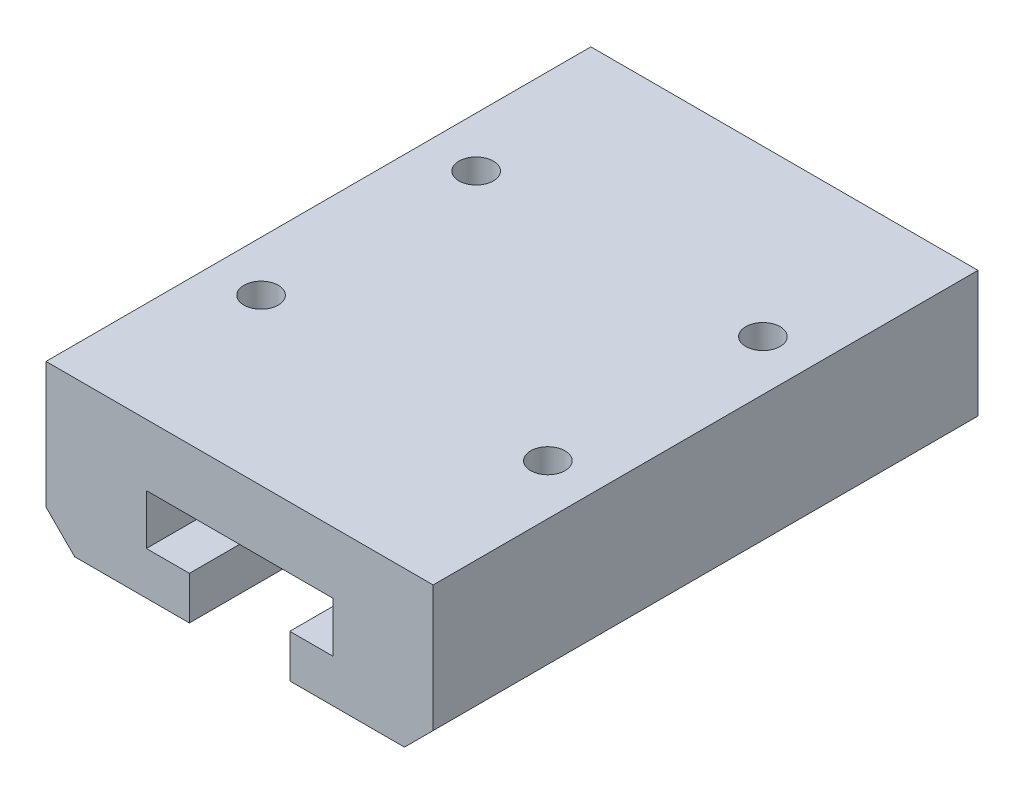
ISO-10303-21;
HEADER;
FILE_DESCRIPTION(('STEP AP214'),'2;1');
FILE_NAME('part.step','',(''),(''),'','','');
FILE_SCHEMA(('AUTOMOTIVE_DESIGN { 1 0 10303 214 1 1 1 1 }'));
ENDSEC;
DATA;
#1=APPLICATION_CONTEXT('core data for automotive mechanical design processes');
#2=APPLICATION_PROTOCOL_DEFINITION('international standard','automotive_design',2000,#1);
#3=PRODUCT_CONTEXT('',#1,'mechanical');
#4=PRODUCT('Part','Part','',(#3));
#5=PRODUCT_RELATED_PRODUCT_CATEGORY('part','',(#4));
#6=PRODUCT_DEFINITION_FORMATION('','',#4);
#7=PRODUCT_DEFINITION_CONTEXT('part definition',#1,'design');
#8=PRODUCT_DEFINITION('design','',#6,#7);
#9=PRODUCT_DEFINITION_SHAPE('','',#8);
#10=(LENGTH_UNIT() NAMED_UNIT(*) SI_UNIT(.MILLI.,.METRE.));
#11=(NAMED_UNIT(*) PLANE_ANGLE_UNIT() SI_UNIT($,.RADIAN.));
#12=(NAMED_UNIT(*) SI_UNIT($,.STERADIAN.) SOLID_ANGLE_UNIT());
#13=UNCERTAINTY_MEASURE_WITH_UNIT(LENGTH_MEASURE(1.E-05),#10,'distance_accuracy_value','');
#14=(GEOMETRIC_REPRESENTATION_CONTEXT(3) GLOBAL_UNCERTAINTY_ASSIGNED_CONTEXT((#13)) GLOBAL_UNIT_ASSIGNED_CONTEXT((#10,
#11,#12)) REPRESENTATION_CONTEXT('',''));
#15=CARTESIAN_POINT('',(0.,0.,0.));
#16=DIRECTION('',(0.,0.,1.));
#17=DIRECTION('',(1.,0.,0.));
#18=AXIS2_PLACEMENT_3D('',#15,#16,#17);
#19=CARTESIAN_POINT('',(-13.5,0.,-19.));
#20=DIRECTION('',(0.,-1.,0.));
#21=DIRECTION('',(1.,0.,0.));
#22=AXIS2_PLACEMENT_3D('',#19,#20,#21);
#23=PLANE('',#22);
#24=DIRECTION('',(1.,0.,0.));
#25=VECTOR('',#24,1.);
#26=CARTESIAN_POINT('',(-13.5,0.,19.));
#27=LINE('',#26,#25);
#28=CARTESIAN_POINT('',(-11.5,0.,19.));
#29=VERTEX_POINT('',#28);
#30=CARTESIAN_POINT('',(-3.5,0.,19.));
#31=VERTEX_POINT('',#30);
#32=EDGE_CURVE('E156',#29,#31,#27,.T.);
#33=ORIENTED_EDGE('',*,*,#32,.F.);
#34=DIRECTION('',(0.,0.,-1.));
#35=VECTOR('',#34,1.);
#36=CARTESIAN_POINT('',(-11.5,0.,-19.));
#37=LINE('',#36,#35);
#38=CARTESIAN_POINT('',(-11.5,0.,9.5));
#39=VERTEX_POINT('',#38);
#40=EDGE_CURVE('E269',#29,#39,#37,.T.);
#41=ORIENTED_EDGE('',*,*,#40,.T.);
#42=CARTESIAN_POINT('',(-10.,0.,7.5));
#43=DIRECTION('',(0.,-1.,0.));
#44=DIRECTION('',(0.,0.,-1.));
#45=AXIS2_PLACEMENT_3D('',#42,#43,#44);
#46=CIRCLE('',#45,2.5);
#47=CARTESIAN_POINT('',(-11.5,0.,5.5));
#48=VERTEX_POINT('',#47);
#49=EDGE_CURVE('E322',#48,#39,#46,.T.);
#50=ORIENTED_EDGE('',*,*,#49,.F.);
#51=DIRECTION('',(0.,0.,-1.));
#52=VECTOR('',#51,1.);
#53=CARTESIAN_POINT('',(-11.5,0.,-19.));
#54=LINE('',#53,#52);
#55=CARTESIAN_POINT('',(-11.5,0.,-5.5));
#56=VERTEX_POINT('',#55);
#57=EDGE_CURVE('E267',#48,#56,#54,.T.);
#58=ORIENTED_EDGE('',*,*,#57,.T.);
#59=CARTESIAN_POINT('',(-10.,0.,-7.5));
#60=DIRECTION('',(0.,-1.,0.));
#61=DIRECTION('',(0.,0.,-1.));
#62=AXIS2_PLACEMENT_3D('',#59,#60,#61);
#63=CIRCLE('',#62,2.5);
#64=CARTESIAN_POINT('',(-11.5,0.,-9.5));
#65=VERTEX_POINT('',#64);
#66=EDGE_CURVE('E341',#65,#56,#63,.T.);
#67=ORIENTED_EDGE('',*,*,#66,.F.);
#68=DIRECTION('',(0.,0.,-1.));
#69=VECTOR('',#68,1.);
#70=CARTESIAN_POINT('',(-11.5,0.,-19.));
#71=LINE('',#70,#69);
#72=CARTESIAN_POINT('',(-11.5,0.,-19.));
#73=VERTEX_POINT('',#72);
#74=EDGE_CURVE('E265',#65,#73,#71,.T.);
#75=ORIENTED_EDGE('',*,*,#74,.T.);
#76=DIRECTION('',(1.,0.,0.));
#77=VECTOR('',#76,1.);
#78=CARTESIAN_POINT('',(-13.5,0.,-19.));
#79=LINE('',#78,#77);
#80=CARTESIAN_POINT('',(-3.5,0.,-19.));
#81=VERTEX_POINT('',#80);
#82=EDGE_CURVE('E172',#73,#81,#79,.T.);
#83=ORIENTED_EDGE('',*,*,#82,.T.);
#84=DIRECTION('',(0.,0.,1.));
#85=VECTOR('',#84,1.);
#86=CARTESIAN_POINT('',(-3.5,0.,-19.));
#87=LINE('',#86,#85);
#88=EDGE_CURVE('E170',#81,#31,#87,.T.);
#89=ORIENTED_EDGE('',*,*,#88,.T.);
#90=EDGE_LOOP('',(#33,#41,#50,#58,#67,#75,#83,#89));
#91=FACE_BOUND('',#90,.T.);
#92=ADVANCED_FACE('F32',(#91),#23,.T.);
#93=CARTESIAN_POINT('',(-13.5,10.8,-19.));
#94=DIRECTION('',(-1.,0.,0.));
#95=DIRECTION('',(0.,-1.,0.));
#96=AXIS2_PLACEMENT_3D('',#93,#94,#95);
#97=PLANE('',#96);
#98=DIRECTION('',(0.,-1.,0.));
#99=VECTOR('',#98,1.);
#100=CARTESIAN_POINT('',(-13.5,10.8,-19.));
#101=LINE('',#100,#99);
#102=CARTESIAN_POINT('',(-13.5,10.8,-19.));
#103=VERTEX_POINT('',#102);
#104=CARTESIAN_POINT('',(-13.5,2.,-19.));
#105=VERTEX_POINT('',#104);
#106=EDGE_CURVE('E177',#103,#105,#101,.T.);
#107=ORIENTED_EDGE('',*,*,#106,.T.);
#108=DIRECTION('',(0.,0.,1.));
#109=VECTOR('',#108,1.);
#110=CARTESIAN_POINT('',(-13.5,2.,-19.));
#111=LINE('',#110,#109);
#112=CARTESIAN_POINT('',(-13.5,2.,19.));
#113=VERTEX_POINT('',#112);
#114=EDGE_CURVE('E243',#105,#113,#111,.T.);
#115=ORIENTED_EDGE('',*,*,#114,.T.);
#116=DIRECTION('',(0.,-1.,0.));
#117=VECTOR('',#116,1.);
#118=CARTESIAN_POINT('',(-13.5,10.8,19.));
#119=LINE('',#118,#117);
#120=CARTESIAN_POINT('',(-13.5,10.8,19.));
#121=VERTEX_POINT('',#120);
#122=EDGE_CURVE('E208',#121,#113,#119,.T.);
#123=ORIENTED_EDGE('',*,*,#122,.F.);
#124=DIRECTION('',(0.,0.,1.));
#125=VECTOR('',#124,1.);
#126=CARTESIAN_POINT('',(-13.5,10.8,-19.));
#127=LINE('',#126,#125);
#128=EDGE_CURVE('E241',#103,#121,#127,.T.);
#129=ORIENTED_EDGE('',*,*,#128,.F.);
#130=EDGE_LOOP('',(#107,#115,#123,#129));
#131=FACE_BOUND('',#130,.T.);
#132=ADVANCED_FACE('F311',(#131),#97,.T.);
#133=CARTESIAN_POINT('',(13.5,10.8,-19.));
#134=DIRECTION('',(0.,1.,0.));
#135=DIRECTION('',(0.,0.,1.));
#136=AXIS2_PLACEMENT_3D('',#133,#134,#135);
#137=PLANE('',#136);
#138=CARTESIAN_POINT('',(10.,10.8,7.5));
#139=DIRECTION('',(0.,-1.,0.));
#140=DIRECTION('',(0.,0.,-1.));
#141=AXIS2_PLACEMENT_3D('',#138,#139,#140);
#142=CIRCLE('',#141,1.2);
#143=CARTESIAN_POINT('',(10.,10.8,6.3));
#144=VERTEX_POINT('',#143);
#145=EDGE_CURVE('E401',#144,#144,#142,.T.);
#146=ORIENTED_EDGE('',*,*,#145,.T.);
#147=EDGE_LOOP('',(#146));
#148=FACE_BOUND('',#147,.T.);
#149=CARTESIAN_POINT('',(10.,10.8,-7.5));
#150=DIRECTION('',(0.,-1.,0.));
#151=DIRECTION('',(0.,0.,-1.));
#152=AXIS2_PLACEMENT_3D('',#149,#150,#151);
#153=CIRCLE('',#152,1.2);
#154=CARTESIAN_POINT('',(10.,10.8,-8.7));
#155=VERTEX_POINT('',#154);
#156=EDGE_CURVE('E326',#155,#155,#153,.T.);
#157=ORIENTED_EDGE('',*,*,#156,.T.);
#158=EDGE_LOOP('',(#157));
#159=FACE_BOUND('',#158,.T.);
#160=CARTESIAN_POINT('',(-10.,10.8,7.5));
#161=DIRECTION('',(0.,-1.,0.));
#162=DIRECTION('',(0.,0.,-1.));
#163=AXIS2_PLACEMENT_3D('',#160,#161,#162);
#164=CIRCLE('',#163,1.2);
#165=CARTESIAN_POINT('',(-10.,10.8,6.3));
#166=VERTEX_POINT('',#165);
#167=EDGE_CURVE('E338',#166,#166,#164,.T.);
#168=ORIENTED_EDGE('',*,*,#167,.T.);
#169=EDGE_LOOP('',(#168));
#170=FACE_BOUND('',#169,.T.);
#171=CARTESIAN_POINT('',(-10.,10.8,-7.5));
#172=DIRECTION('',(0.,-1.,0.));
#173=DIRECTION('',(0.,0.,-1.));
#174=AXIS2_PLACEMENT_3D('',#171,#172,#173);
#175=CIRCLE('',#174,1.2);
#176=CARTESIAN_POINT('',(-10.,10.8,-8.7));
#177=VERTEX_POINT('',#176);
#178=EDGE_CURVE('E167',#177,#177,#175,.T.);
#179=ORIENTED_EDGE('',*,*,#178,.T.);
#180=EDGE_LOOP('',(#179));
#181=FACE_BOUND('',#180,.T.);
#182=ORIENTED_EDGE('',*,*,#128,.T.);
#183=DIRECTION('',(-1.,0.,0.));
#184=VECTOR('',#183,1.);
#185=CARTESIAN_POINT('',(13.5,10.8,19.));
#186=LINE('',#185,#184);
#187=CARTESIAN_POINT('',(13.5,10.8,19.));
#188=VERTEX_POINT('',#187);
#189=EDGE_CURVE('E205',#188,#121,#186,.T.);
#190=ORIENTED_EDGE('',*,*,#189,.F.);
#191=DIRECTION('',(0.,0.,1.));
#192=VECTOR('',#191,1.);
#193=CARTESIAN_POINT('',(13.5,10.8,-19.));
#194=LINE('',#193,#192);
#195=CARTESIAN_POINT('',(13.5,10.8,-19.));
#196=VERTEX_POINT('',#195);
#197=EDGE_CURVE('E244',#196,#188,#194,.T.);
#198=ORIENTED_EDGE('',*,*,#197,.F.);
#199=DIRECTION('',(-1.,0.,0.));
#200=VECTOR('',#199,1.);
#201=CARTESIAN_POINT('',(13.5,10.8,-19.));
#202=LINE('',#201,#200);
#203=EDGE_CURVE('E236',#196,#103,#202,.T.);
#204=ORIENTED_EDGE('',*,*,#203,.T.);
#205=EDGE_LOOP('',(#182,#190,#198,#204));
#206=FACE_BOUND('',#205,.T.);
#207=ADVANCED_FACE('F308',(#148,#159,#170,#181,#206),#137,.T.);
#208=CARTESIAN_POINT('',(13.5,10.8,-19.));
#209=DIRECTION('',(1.,0.,0.));
#210=DIRECTION('',(0.,1.,0.));
#211=AXIS2_PLACEMENT_3D('',#208,#209,#210);
#212=PLANE('',#211);
#213=DIRECTION('',(0.,1.,0.));
#214=VECTOR('',#213,1.);
#215=CARTESIAN_POINT('',(13.5,10.8,19.));
#216=LINE('',#215,#214);
#217=CARTESIAN_POINT('',(13.5,2.,19.));
#218=VERTEX_POINT('',#217);
#219=EDGE_CURVE('E203',#218,#188,#216,.T.);
#220=ORIENTED_EDGE('',*,*,#219,.F.);
#221=DIRECTION('',(0.,0.,-1.));
#222=VECTOR('',#221,1.);
#223=CARTESIAN_POINT('',(13.5,2.,-19.));
#224=LINE('',#223,#222);
#225=CARTESIAN_POINT('',(13.5,2.,-19.));
#226=VERTEX_POINT('',#225);
#227=EDGE_CURVE('E11',#218,#226,#224,.T.);
#228=ORIENTED_EDGE('',*,*,#227,.T.);
#229=DIRECTION('',(0.,1.,0.));
#230=VECTOR('',#229,1.);
#231=CARTESIAN_POINT('',(13.5,10.8,-19.));
#232=LINE('',#231,#230);
#233=EDGE_CURVE('E234',#226,#196,#232,.T.);
#234=ORIENTED_EDGE('',*,*,#233,.T.);
#235=ORIENTED_EDGE('',*,*,#197,.T.);
#236=EDGE_LOOP('',(#220,#228,#234,#235));
#237=FACE_BOUND('',#236,.T.);
#238=ADVANCED_FACE('F302',(#237),#212,.T.);
#239=CARTESIAN_POINT('',(13.5,0.,-19.));
#240=DIRECTION('',(0.,-1.,0.));
#241=DIRECTION('',(1.,0.,0.));
#242=AXIS2_PLACEMENT_3D('',#239,#240,#241);
#243=PLANE('',#242);
#244=DIRECTION('',(1.,0.,0.));
#245=VECTOR('',#244,1.);
#246=CARTESIAN_POINT('',(13.5,0.,-19.));
#247=LINE('',#246,#245);
#248=CARTESIAN_POINT('',(3.5,0.,-19.));
#249=VERTEX_POINT('',#248);
#250=CARTESIAN_POINT('',(11.5,0.,-19.));
#251=VERTEX_POINT('',#250);
#252=EDGE_CURVE('E231',#249,#251,#247,.T.);
#253=ORIENTED_EDGE('',*,*,#252,.T.);
#254=DIRECTION('',(0.,0.,1.));
#255=VECTOR('',#254,1.);
#256=CARTESIAN_POINT('',(11.5,0.,-19.));
#257=LINE('',#256,#255);
#258=CARTESIAN_POINT('',(11.5,0.,-9.49999999999999));
#259=VERTEX_POINT('',#258);
#260=EDGE_CURVE('E283',#251,#259,#257,.T.);
#261=ORIENTED_EDGE('',*,*,#260,.T.);
#262=CARTESIAN_POINT('',(10.,0.,-7.5));
#263=DIRECTION('',(0.,-1.,0.));
#264=DIRECTION('',(0.,0.,-1.));
#265=AXIS2_PLACEMENT_3D('',#262,#263,#264);
#266=CIRCLE('',#265,2.5);
#267=CARTESIAN_POINT('',(11.5,0.,-5.5));
#268=VERTEX_POINT('',#267);
#269=EDGE_CURVE('E398',#268,#259,#266,.T.);
#270=ORIENTED_EDGE('',*,*,#269,.F.);
#271=DIRECTION('',(0.,0.,1.));
#272=VECTOR('',#271,1.);
#273=CARTESIAN_POINT('',(11.5,0.,-19.));
#274=LINE('',#273,#272);
#275=CARTESIAN_POINT('',(11.5,0.,5.50000000000001));
#276=VERTEX_POINT('',#275);
#277=EDGE_CURVE('E281',#268,#276,#274,.T.);
#278=ORIENTED_EDGE('',*,*,#277,.T.);
#279=CARTESIAN_POINT('',(10.,0.,7.5));
#280=DIRECTION('',(0.,-1.,0.));
#281=DIRECTION('',(0.,0.,-1.));
#282=AXIS2_PLACEMENT_3D('',#279,#280,#281);
#283=CIRCLE('',#282,2.5);
#284=CARTESIAN_POINT('',(11.5,0.,9.5));
#285=VERTEX_POINT('',#284);
#286=EDGE_CURVE('E290',#285,#276,#283,.T.);
#287=ORIENTED_EDGE('',*,*,#286,.F.);
#288=DIRECTION('',(0.,0.,1.));
#289=VECTOR('',#288,1.);
#290=CARTESIAN_POINT('',(11.5,0.,-19.));
#291=LINE('',#290,#289);
#292=CARTESIAN_POINT('',(11.5,0.,19.));
#293=VERTEX_POINT('',#292);
#294=EDGE_CURVE('E279',#285,#293,#291,.T.);
#295=ORIENTED_EDGE('',*,*,#294,.T.);
#296=DIRECTION('',(1.,0.,0.));
#297=VECTOR('',#296,1.);
#298=CARTESIAN_POINT('',(13.5,0.,19.));
#299=LINE('',#298,#297);
#300=CARTESIAN_POINT('',(3.5,0.,19.));
#301=VERTEX_POINT('',#300);
#302=EDGE_CURVE('E200',#301,#293,#299,.T.);
#303=ORIENTED_EDGE('',*,*,#302,.F.);
#304=DIRECTION('',(0.,0.,1.));
#305=VECTOR('',#304,1.);
#306=CARTESIAN_POINT('',(3.5,0.,-19.));
#307=LINE('',#306,#305);
#308=EDGE_CURVE('E247',#249,#301,#307,.T.);
#309=ORIENTED_EDGE('',*,*,#308,.F.);
#310=EDGE_LOOP('',(#253,#261,#270,#278,#287,#295,#303,#309));
#311=FACE_BOUND('',#310,.T.);
#312=ADVANCED_FACE('F293',(#311),#243,.T.);
#313=CARTESIAN_POINT('',(3.5,0.,-19.));
#314=DIRECTION('',(-1.,0.,0.));
#315=DIRECTION('',(0.,-1.,0.));
#316=AXIS2_PLACEMENT_3D('',#313,#314,#315);
#317=PLANE('',#316);
#318=ORIENTED_EDGE('',*,*,#308,.T.);
#319=DIRECTION('',(0.,-1.,0.));
#320=VECTOR('',#319,1.);
#321=CARTESIAN_POINT('',(3.5,0.,19.));
#322=LINE('',#321,#320);
#323=CARTESIAN_POINT('',(3.5,3.,19.));
#324=VERTEX_POINT('',#323);
#325=EDGE_CURVE('E197',#324,#301,#322,.T.);
#326=ORIENTED_EDGE('',*,*,#325,.F.);
#327=DIRECTION('',(0.,0.,1.));
#328=VECTOR('',#327,1.);
#329=CARTESIAN_POINT('',(3.5,3.,-19.));
#330=LINE('',#329,#328);
#331=CARTESIAN_POINT('',(3.5,3.,-19.));
#332=VERTEX_POINT('',#331);
#333=EDGE_CURVE('E249',#332,#324,#330,.T.);
#334=ORIENTED_EDGE('',*,*,#333,.F.);
#335=DIRECTION('',(0.,-1.,0.));
#336=VECTOR('',#335,1.);
#337=CARTESIAN_POINT('',(3.5,0.,-19.));
#338=LINE('',#337,#336);
#339=EDGE_CURVE('E228',#332,#249,#338,.T.);
#340=ORIENTED_EDGE('',*,*,#339,.T.);
#341=EDGE_LOOP('',(#318,#326,#334,#340));
#342=FACE_BOUND('',#341,.T.);
#343=ADVANCED_FACE('F396',(#342),#317,.T.);
#344=CARTESIAN_POINT('',(3.5,3.,-19.));
#345=DIRECTION('',(0.,1.,0.));
#346=DIRECTION('',(-1.,0.,0.));
#347=AXIS2_PLACEMENT_3D('',#344,#345,#346);
#348=PLANE('',#347);
#349=ORIENTED_EDGE('',*,*,#333,.T.);
#350=DIRECTION('',(-1.,0.,0.));
#351=VECTOR('',#350,1.);
#352=CARTESIAN_POINT('',(3.5,3.,19.));
#353=LINE('',#352,#351);
#354=CARTESIAN_POINT('',(6.5,3.,19.));
#355=VERTEX_POINT('',#354);
#356=EDGE_CURVE('E194',#355,#324,#353,.T.);
#357=ORIENTED_EDGE('',*,*,#356,.F.);
#358=DIRECTION('',(0.,0.,1.));
#359=VECTOR('',#358,1.);
#360=CARTESIAN_POINT('',(6.5,3.,-19.));
#361=LINE('',#360,#359);
#362=CARTESIAN_POINT('',(6.5,3.,-19.));
#363=VERTEX_POINT('',#362);
#364=EDGE_CURVE('E251',#363,#355,#361,.T.);
#365=ORIENTED_EDGE('',*,*,#364,.F.);
#366=DIRECTION('',(-1.,0.,0.));
#367=VECTOR('',#366,1.);
#368=CARTESIAN_POINT('',(3.5,3.,-19.));
#369=LINE('',#368,#367);
#370=EDGE_CURVE('E225',#363,#332,#369,.T.);
#371=ORIENTED_EDGE('',*,*,#370,.T.);
#372=EDGE_LOOP('',(#349,#357,#365,#371));
#373=FACE_BOUND('',#372,.T.);
#374=ADVANCED_FACE('F394',(#373),#348,.T.);
#375=CARTESIAN_POINT('',(6.5,3.,-19.));
#376=DIRECTION('',(-1.,0.,0.));
#377=DIRECTION('',(0.,0.,1.));
#378=AXIS2_PLACEMENT_3D('',#375,#376,#377);
#379=PLANE('',#378);
#380=ORIENTED_EDGE('',*,*,#364,.T.);
#381=DIRECTION('',(0.,-1.,0.));
#382=VECTOR('',#381,1.);
#383=CARTESIAN_POINT('',(6.5,3.,19.));
#384=LINE('',#383,#382);
#385=CARTESIAN_POINT('',(6.5,6.5,19.));
#386=VERTEX_POINT('',#385);
#387=EDGE_CURVE('E191',#386,#355,#384,.T.);
#388=ORIENTED_EDGE('',*,*,#387,.F.);
#389=DIRECTION('',(0.,0.,1.));
#390=VECTOR('',#389,1.);
#391=CARTESIAN_POINT('',(6.5,6.5,-19.));
#392=LINE('',#391,#390);
#393=CARTESIAN_POINT('',(6.5,6.5,-19.));
#394=VERTEX_POINT('',#393);
#395=EDGE_CURVE('E253',#394,#386,#392,.T.);
#396=ORIENTED_EDGE('',*,*,#395,.F.);
#397=DIRECTION('',(0.,-1.,0.));
#398=VECTOR('',#397,1.);
#399=CARTESIAN_POINT('',(6.5,3.,-19.));
#400=LINE('',#399,#398);
#401=EDGE_CURVE('E222',#394,#363,#400,.T.);
#402=ORIENTED_EDGE('',*,*,#401,.T.);
#403=EDGE_LOOP('',(#380,#388,#396,#402));
#404=FACE_BOUND('',#403,.T.);
#405=ADVANCED_FACE('F389',(#404),#379,.T.);
#406=CARTESIAN_POINT('',(-6.5,6.5,-19.));
#407=DIRECTION('',(0.,-1.,0.));
#408=DIRECTION('',(0.,0.,-1.));
#409=AXIS2_PLACEMENT_3D('',#406,#407,#408);
#410=PLANE('',#409);
#411=ORIENTED_EDGE('',*,*,#395,.T.);
#412=DIRECTION('',(1.,0.,0.));
#413=VECTOR('',#412,1.);
#414=CARTESIAN_POINT('',(-6.5,6.5,19.));
#415=LINE('',#414,#413);
#416=CARTESIAN_POINT('',(-6.5,6.5,19.));
#417=VERTEX_POINT('',#416);
#418=EDGE_CURVE('E188',#417,#386,#415,.T.);
#419=ORIENTED_EDGE('',*,*,#418,.F.);
#420=DIRECTION('',(0.,0.,1.));
#421=VECTOR('',#420,1.);
#422=CARTESIAN_POINT('',(-6.5,6.5,-19.));
#423=LINE('',#422,#421);
#424=CARTESIAN_POINT('',(-6.5,6.5,-19.));
#425=VERTEX_POINT('',#424);
#426=EDGE_CURVE('E255',#425,#417,#423,.T.);
#427=ORIENTED_EDGE('',*,*,#426,.F.);
#428=DIRECTION('',(1.,0.,0.));
#429=VECTOR('',#428,1.);
#430=CARTESIAN_POINT('',(-6.5,6.5,-19.));
#431=LINE('',#430,#429);
#432=EDGE_CURVE('E219',#425,#394,#431,.T.);
#433=ORIENTED_EDGE('',*,*,#432,.T.);
#434=EDGE_LOOP('',(#411,#419,#427,#433));
#435=FACE_BOUND('',#434,.T.);
#436=ADVANCED_FACE('F384',(#435),#410,.T.);
#437=CARTESIAN_POINT('',(-6.5,3.,-19.));
#438=DIRECTION('',(1.,0.,0.));
#439=DIRECTION('',(0.,0.,-1.));
#440=AXIS2_PLACEMENT_3D('',#437,#438,#439);
#441=PLANE('',#440);
#442=ORIENTED_EDGE('',*,*,#426,.T.);
#443=DIRECTION('',(0.,1.,0.));
#444=VECTOR('',#443,1.);
#445=CARTESIAN_POINT('',(-6.5,3.,19.));
#446=LINE('',#445,#444);
#447=CARTESIAN_POINT('',(-6.5,3.,19.));
#448=VERTEX_POINT('',#447);
#449=EDGE_CURVE('E182',#448,#417,#446,.T.);
#450=ORIENTED_EDGE('',*,*,#449,.F.);
#451=DIRECTION('',(0.,0.,1.));
#452=VECTOR('',#451,1.);
#453=CARTESIAN_POINT('',(-6.5,3.,-19.));
#454=LINE('',#453,#452);
#455=CARTESIAN_POINT('',(-6.5,3.,-19.));
#456=VERTEX_POINT('',#455);
#457=EDGE_CURVE('E257',#456,#448,#454,.T.);
#458=ORIENTED_EDGE('',*,*,#457,.F.);
#459=DIRECTION('',(0.,1.,0.));
#460=VECTOR('',#459,1.);
#461=CARTESIAN_POINT('',(-6.5,3.,-19.));
#462=LINE('',#461,#460);
#463=EDGE_CURVE('E216',#456,#425,#462,.T.);
#464=ORIENTED_EDGE('',*,*,#463,.T.);
#465=EDGE_LOOP('',(#442,#450,#458,#464));
#466=FACE_BOUND('',#465,.T.);
#467=ADVANCED_FACE('F382',(#466),#441,.T.);
#468=CARTESIAN_POINT('',(-3.5,3.,-19.));
#469=DIRECTION('',(0.,1.,0.));
#470=DIRECTION('',(-1.,0.,0.));
#471=AXIS2_PLACEMENT_3D('',#468,#469,#470);
#472=PLANE('',#471);
#473=ORIENTED_EDGE('',*,*,#457,.T.);
#474=DIRECTION('',(-1.,0.,0.));
#475=VECTOR('',#474,1.);
#476=CARTESIAN_POINT('',(-3.5,3.,19.));
#477=LINE('',#476,#475);
#478=CARTESIAN_POINT('',(-3.5,3.,19.));
#479=VERTEX_POINT('',#478);
#480=EDGE_CURVE('E180',#479,#448,#477,.T.);
#481=ORIENTED_EDGE('',*,*,#480,.F.);
#482=DIRECTION('',(0.,0.,1.));
#483=VECTOR('',#482,1.);
#484=CARTESIAN_POINT('',(-3.5,3.,-19.));
#485=LINE('',#484,#483);
#486=CARTESIAN_POINT('',(-3.5,3.,-19.));
#487=VERTEX_POINT('',#486);
#488=EDGE_CURVE('E176',#487,#479,#485,.T.);
#489=ORIENTED_EDGE('',*,*,#488,.F.);
#490=DIRECTION('',(-1.,0.,0.));
#491=VECTOR('',#490,1.);
#492=CARTESIAN_POINT('',(-3.5,3.,-19.));
#493=LINE('',#492,#491);
#494=EDGE_CURVE('E213',#487,#456,#493,.T.);
#495=ORIENTED_EDGE('',*,*,#494,.T.);
#496=EDGE_LOOP('',(#473,#481,#489,#495));
#497=FACE_BOUND('',#496,.T.);
#498=ADVANCED_FACE('F378',(#497),#472,.T.);
#499=CARTESIAN_POINT('',(-3.5,0.,-19.));
#500=DIRECTION('',(1.,0.,0.));
#501=DIRECTION('',(0.,1.,0.));
#502=AXIS2_PLACEMENT_3D('',#499,#500,#501);
#503=PLANE('',#502);
#504=ORIENTED_EDGE('',*,*,#488,.T.);
#505=DIRECTION('',(0.,1.,0.));
#506=VECTOR('',#505,1.);
#507=CARTESIAN_POINT('',(-3.5,0.,19.));
#508=LINE('',#507,#506);
#509=EDGE_CURVE('E162',#31,#479,#508,.T.);
#510=ORIENTED_EDGE('',*,*,#509,.F.);
#511=ORIENTED_EDGE('',*,*,#88,.F.);
#512=DIRECTION('',(0.,1.,0.));
#513=VECTOR('',#512,1.);
#514=CARTESIAN_POINT('',(-3.5,0.,-19.));
#515=LINE('',#514,#513);
#516=EDGE_CURVE('E211',#81,#487,#515,.T.);
#517=ORIENTED_EDGE('',*,*,#516,.T.);
#518=EDGE_LOOP('',(#504,#510,#511,#517));
#519=FACE_BOUND('',#518,.T.);
#520=ADVANCED_FACE('F179',(#519),#503,.T.);
#521=CARTESIAN_POINT('',(0.,0.,-19.));
#522=DIRECTION('',(0.,0.,1.));
#523=DIRECTION('',(1.,0.,0.));
#524=AXIS2_PLACEMENT_3D('',#521,#522,#523);
#525=PLANE('',#524);
#526=ORIENTED_EDGE('',*,*,#82,.F.);
#527=DIRECTION('',(0.707106781186549,-0.707106781186546,0.));
#528=VECTOR('',#527,1.);
#529=CARTESIAN_POINT('',(-13.5,2.,-19.));
#530=LINE('',#529,#528);
#531=EDGE_CURVE('E277',#73,#105,#530,.F.);
#532=ORIENTED_EDGE('',*,*,#531,.T.);
#533=ORIENTED_EDGE('',*,*,#106,.F.);
#534=ORIENTED_EDGE('',*,*,#203,.F.);
#535=ORIENTED_EDGE('',*,*,#233,.F.);
#536=DIRECTION('',(0.707106781186548,0.707106781186548,0.));
#537=VECTOR('',#536,1.);
#538=CARTESIAN_POINT('',(11.5,0.,-19.));
#539=LINE('',#538,#537);
#540=EDGE_CURVE('E275',#226,#251,#539,.F.);
#541=ORIENTED_EDGE('',*,*,#540,.T.);
#542=ORIENTED_EDGE('',*,*,#252,.F.);
#543=ORIENTED_EDGE('',*,*,#339,.F.);
#544=ORIENTED_EDGE('',*,*,#370,.F.);
#545=ORIENTED_EDGE('',*,*,#401,.F.);
#546=ORIENTED_EDGE('',*,*,#432,.F.);
#547=ORIENTED_EDGE('',*,*,#463,.F.);
#548=ORIENTED_EDGE('',*,*,#494,.F.);
#549=ORIENTED_EDGE('',*,*,#516,.F.);
#550=EDGE_LOOP('',(#526,#532,#533,#534,#535,#541,#542,#543,#544,#545,#546,#547,#548,#549));
#551=FACE_BOUND('',#550,.T.);
#552=ADVANCED_FACE('F373',(#551),#525,.F.);
#553=CARTESIAN_POINT('',(0.,0.,19.));
#554=DIRECTION('',(0.,0.,1.));
#555=DIRECTION('',(1.,0.,0.));
#556=AXIS2_PLACEMENT_3D('',#553,#554,#555);
#557=PLANE('',#556);
#558=ORIENTED_EDGE('',*,*,#122,.T.);
#559=DIRECTION('',(-0.707106781186549,0.707106781186546,0.));
#560=VECTOR('',#559,1.);
#561=CARTESIAN_POINT('',(-5.74999999999998,-5.75,19.));
#562=LINE('',#561,#560);
#563=EDGE_CURVE('E164',#113,#29,#562,.F.);
#564=ORIENTED_EDGE('',*,*,#563,.T.);
#565=ORIENTED_EDGE('',*,*,#32,.T.);
#566=ORIENTED_EDGE('',*,*,#509,.T.);
#567=ORIENTED_EDGE('',*,*,#480,.T.);
#568=ORIENTED_EDGE('',*,*,#449,.T.);
#569=ORIENTED_EDGE('',*,*,#418,.T.);
#570=ORIENTED_EDGE('',*,*,#387,.T.);
#571=ORIENTED_EDGE('',*,*,#356,.T.);
#572=ORIENTED_EDGE('',*,*,#325,.T.);
#573=ORIENTED_EDGE('',*,*,#302,.T.);
#574=DIRECTION('',(-0.707106781186548,-0.707106781186548,0.));
#575=VECTOR('',#574,1.);
#576=CARTESIAN_POINT('',(5.75,-5.75,19.));
#577=LINE('',#576,#575);
#578=EDGE_CURVE('E262',#293,#218,#577,.F.);
#579=ORIENTED_EDGE('',*,*,#578,.T.);
#580=ORIENTED_EDGE('',*,*,#219,.T.);
#581=ORIENTED_EDGE('',*,*,#189,.T.);
#582=EDGE_LOOP('',(#558,#564,#565,#566,#567,#568,#569,#570,#571,#572,#573,#579,#580,#581));
#583=FACE_BOUND('',#582,.T.);
#584=ADVANCED_FACE('F159',(#583),#557,.T.);
#585=CARTESIAN_POINT('',(-10.,0.,-7.5));
#586=DIRECTION('',(0.,-1.,0.));
#587=DIRECTION('',(0.,0.,-1.));
#588=AXIS2_PLACEMENT_3D('',#585,#586,#587);
#589=CYLINDRICAL_SURFACE('',#588,1.2);
#590=ORIENTED_EDGE('',*,*,#178,.F.);
#591=EDGE_LOOP('',(#590));
#592=FACE_BOUND('',#591,.T.);
#593=CARTESIAN_POINT('',(-10.,1.6,-7.5));
#594=DIRECTION('',(0.,-1.,0.));
#595=DIRECTION('',(0.,0.,-1.));
#596=AXIS2_PLACEMENT_3D('',#593,#594,#595);
#597=CIRCLE('',#596,1.2);
#598=CARTESIAN_POINT('',(-10.,1.6,-8.7));
#599=VERTEX_POINT('',#598);
#600=EDGE_CURVE('E347',#599,#599,#597,.T.);
#601=ORIENTED_EDGE('',*,*,#600,.T.);
#602=EDGE_LOOP('',(#601));
#603=FACE_BOUND('',#602,.T.);
#604=ADVANCED_FACE('F353',(#592,#603),#589,.F.);
#605=CARTESIAN_POINT('',(-8.8,1.6,-7.5));
#606=DIRECTION('',(0.,1.,0.));
#607=DIRECTION('',(0.,0.,1.));
#608=AXIS2_PLACEMENT_3D('',#605,#606,#607);
#609=PLANE('',#608);
#610=ORIENTED_EDGE('',*,*,#600,.F.);
#611=EDGE_LOOP('',(#610));
#612=FACE_BOUND('',#611,.T.);
#613=CARTESIAN_POINT('',(-10.,1.6,-7.5));
#614=DIRECTION('',(0.,-1.,0.));
#615=DIRECTION('',(0.,0.,-1.));
#616=AXIS2_PLACEMENT_3D('',#613,#614,#615);
#617=CIRCLE('',#616,2.5);
#618=CARTESIAN_POINT('',(-10.,1.6,-10.));
#619=VERTEX_POINT('',#618);
#620=EDGE_CURVE('E344',#619,#619,#617,.T.);
#621=ORIENTED_EDGE('',*,*,#620,.T.);
#622=EDGE_LOOP('',(#621));
#623=FACE_BOUND('',#622,.T.);
#624=ADVANCED_FACE('F356',(#612,#623),#609,.F.);
#625=CARTESIAN_POINT('',(-10.,0.,-7.5));
#626=DIRECTION('',(0.,-1.,0.));
#627=DIRECTION('',(0.,0.,-1.));
#628=AXIS2_PLACEMENT_3D('',#625,#626,#627);
#629=CYLINDRICAL_SURFACE('',#628,2.5);
#630=ORIENTED_EDGE('',*,*,#620,.F.);
#631=EDGE_LOOP('',(#630));
#632=FACE_BOUND('',#631,.T.);
#633=ORIENTED_EDGE('',*,*,#66,.T.);
#634=CARTESIAN_POINT('',(-10.,-1.49999999999999,-7.5));
#635=DIRECTION('',(0.707106781186546,0.707106781186549,0.));
#636=DIRECTION('',(0.707106781186549,-0.707106781186546,0.));
#637=AXIS2_PLACEMENT_3D('',#634,#635,#636);
#638=ELLIPSE('',#637,3.53553390593273,2.5);
#639=EDGE_CURVE('E273',#56,#65,#638,.F.);
#640=ORIENTED_EDGE('',*,*,#639,.T.);
#641=EDGE_LOOP('',(#633,#640));
#642=FACE_BOUND('',#641,.T.);
#643=ADVANCED_FACE('F362',(#632,#642),#629,.F.);
#644=CARTESIAN_POINT('',(-10.,0.,7.5));
#645=DIRECTION('',(0.,-1.,0.));
#646=DIRECTION('',(0.,0.,-1.));
#647=AXIS2_PLACEMENT_3D('',#644,#645,#646);
#648=CYLINDRICAL_SURFACE('',#647,1.2);
#649=ORIENTED_EDGE('',*,*,#167,.F.);
#650=EDGE_LOOP('',(#649));
#651=FACE_BOUND('',#650,.T.);
#652=CARTESIAN_POINT('',(-10.,1.6,7.5));
#653=DIRECTION('',(0.,-1.,0.));
#654=DIRECTION('',(0.,0.,-1.));
#655=AXIS2_PLACEMENT_3D('',#652,#653,#654);
#656=CIRCLE('',#655,1.2);
#657=CARTESIAN_POINT('',(-10.,1.6,6.3));
#658=VERTEX_POINT('',#657);
#659=EDGE_CURVE('E329',#658,#658,#656,.T.);
#660=ORIENTED_EDGE('',*,*,#659,.T.);
#661=EDGE_LOOP('',(#660));
#662=FACE_BOUND('',#661,.T.);
#663=ADVANCED_FACE('F368',(#651,#662),#648,.F.);
#664=CARTESIAN_POINT('',(-8.8,1.6,7.5));
#665=DIRECTION('',(0.,1.,0.));
#666=DIRECTION('',(0.,0.,1.));
#667=AXIS2_PLACEMENT_3D('',#664,#665,#666);
#668=PLANE('',#667);
#669=ORIENTED_EDGE('',*,*,#659,.F.);
#670=EDGE_LOOP('',(#669));
#671=FACE_BOUND('',#670,.T.);
#672=CARTESIAN_POINT('',(-10.,1.6,7.5));
#673=DIRECTION('',(0.,-1.,0.));
#674=DIRECTION('',(0.,0.,-1.));
#675=AXIS2_PLACEMENT_3D('',#672,#673,#674);
#676=CIRCLE('',#675,2.5);
#677=CARTESIAN_POINT('',(-10.,1.6,5.));
#678=VERTEX_POINT('',#677);
#679=EDGE_CURVE('E325',#678,#678,#676,.T.);
#680=ORIENTED_EDGE('',*,*,#679,.T.);
#681=EDGE_LOOP('',(#680));
#682=FACE_BOUND('',#681,.T.);
#683=ADVANCED_FACE('F485',(#671,#682),#668,.F.);
#684=CARTESIAN_POINT('',(-10.,0.,7.5));
#685=DIRECTION('',(0.,-1.,0.));
#686=DIRECTION('',(0.,0.,-1.));
#687=AXIS2_PLACEMENT_3D('',#684,#685,#686);
#688=CYLINDRICAL_SURFACE('',#687,2.5);
#689=ORIENTED_EDGE('',*,*,#679,.F.);
#690=EDGE_LOOP('',(#689));
#691=FACE_BOUND('',#690,.T.);
#692=ORIENTED_EDGE('',*,*,#49,.T.);
#693=CARTESIAN_POINT('',(-10.,-1.49999999999999,7.5));
#694=DIRECTION('',(0.707106781186546,0.707106781186549,0.));
#695=DIRECTION('',(0.707106781186549,-0.707106781186546,0.));
#696=AXIS2_PLACEMENT_3D('',#693,#694,#695);
#697=ELLIPSE('',#696,3.53553390593273,2.5);
#698=EDGE_CURVE('E271',#39,#48,#697,.F.);
#699=ORIENTED_EDGE('',*,*,#698,.T.);
#700=EDGE_LOOP('',(#692,#699));
#701=FACE_BOUND('',#700,.T.);
#702=ADVANCED_FACE('F324',(#691,#701),#688,.F.);
#703=CARTESIAN_POINT('',(10.,0.,-7.5));
#704=DIRECTION('',(0.,-1.,0.));
#705=DIRECTION('',(0.,0.,-1.));
#706=AXIS2_PLACEMENT_3D('',#703,#704,#705);
#707=CYLINDRICAL_SURFACE('',#706,1.2);
#708=ORIENTED_EDGE('',*,*,#156,.F.);
#709=EDGE_LOOP('',(#708));
#710=FACE_BOUND('',#709,.T.);
#711=CARTESIAN_POINT('',(10.,1.6,-7.5));
#712=DIRECTION('',(0.,-1.,0.));
#713=DIRECTION('',(0.,0.,-1.));
#714=AXIS2_PLACEMENT_3D('',#711,#712,#713);
#715=CIRCLE('',#714,1.2);
#716=CARTESIAN_POINT('',(10.,1.6,-8.7));
#717=VERTEX_POINT('',#716);
#718=EDGE_CURVE('E332',#717,#717,#715,.T.);
#719=ORIENTED_EDGE('',*,*,#718,.T.);
#720=EDGE_LOOP('',(#719));
#721=FACE_BOUND('',#720,.T.);
#722=ADVANCED_FACE('F412',(#710,#721),#707,.F.);
#723=CARTESIAN_POINT('',(11.2,1.6,-7.5));
#724=DIRECTION('',(0.,1.,0.));
#725=DIRECTION('',(0.,0.,1.));
#726=AXIS2_PLACEMENT_3D('',#723,#724,#725);
#727=PLANE('',#726);
#728=ORIENTED_EDGE('',*,*,#718,.F.);
#729=EDGE_LOOP('',(#728));
#730=FACE_BOUND('',#729,.T.);
#731=CARTESIAN_POINT('',(10.,1.6,-7.5));
#732=DIRECTION('',(0.,-1.,0.));
#733=DIRECTION('',(0.,0.,-1.));
#734=AXIS2_PLACEMENT_3D('',#731,#732,#733);
#735=CIRCLE('',#734,2.5);
#736=CARTESIAN_POINT('',(10.,1.6,-10.));
#737=VERTEX_POINT('',#736);
#738=EDGE_CURVE('E400',#737,#737,#735,.T.);
#739=ORIENTED_EDGE('',*,*,#738,.T.);
#740=EDGE_LOOP('',(#739));
#741=FACE_BOUND('',#740,.T.);
#742=ADVANCED_FACE('F414',(#730,#741),#727,.F.);
#743=CARTESIAN_POINT('',(10.,0.,-7.5));
#744=DIRECTION('',(0.,-1.,0.));
#745=DIRECTION('',(0.,0.,-1.));
#746=AXIS2_PLACEMENT_3D('',#743,#744,#745);
#747=CYLINDRICAL_SURFACE('',#746,2.5);
#748=ORIENTED_EDGE('',*,*,#738,.F.);
#749=EDGE_LOOP('',(#748));
#750=FACE_BOUND('',#749,.T.);
#751=ORIENTED_EDGE('',*,*,#269,.T.);
#752=CARTESIAN_POINT('',(10.,-1.5,-7.5));
#753=DIRECTION('',(-0.707106781186548,0.707106781186548,0.));
#754=DIRECTION('',(-0.707106781186548,-0.707106781186548,0.));
#755=AXIS2_PLACEMENT_3D('',#752,#753,#754);
#756=ELLIPSE('',#755,3.53553390593274,2.5);
#757=EDGE_CURVE('E46',#259,#268,#756,.F.);
#758=ORIENTED_EDGE('',*,*,#757,.T.);
#759=EDGE_LOOP('',(#751,#758));
#760=FACE_BOUND('',#759,.T.);
#761=ADVANCED_FACE('F399',(#750,#760),#747,.F.);
#762=CARTESIAN_POINT('',(10.,0.,7.5));
#763=DIRECTION('',(0.,-1.,0.));
#764=DIRECTION('',(0.,0.,-1.));
#765=AXIS2_PLACEMENT_3D('',#762,#763,#764);
#766=CYLINDRICAL_SURFACE('',#765,1.2);
#767=ORIENTED_EDGE('',*,*,#145,.F.);
#768=EDGE_LOOP('',(#767));
#769=FACE_BOUND('',#768,.T.);
#770=CARTESIAN_POINT('',(10.,1.6,7.5));
#771=DIRECTION('',(0.,-1.,0.));
#772=DIRECTION('',(0.,0.,-1.));
#773=AXIS2_PLACEMENT_3D('',#770,#771,#772);
#774=CIRCLE('',#773,1.2);
#775=CARTESIAN_POINT('',(10.,1.6,6.3));
#776=VERTEX_POINT('',#775);
#777=EDGE_CURVE('E406',#776,#776,#774,.T.);
#778=ORIENTED_EDGE('',*,*,#777,.T.);
#779=EDGE_LOOP('',(#778));
#780=FACE_BOUND('',#779,.T.);
#781=ADVANCED_FACE('F421',(#769,#780),#766,.F.);
#782=CARTESIAN_POINT('',(11.2,1.6,7.5));
#783=DIRECTION('',(0.,1.,0.));
#784=DIRECTION('',(0.,0.,1.));
#785=AXIS2_PLACEMENT_3D('',#782,#783,#784);
#786=PLANE('',#785);
#787=ORIENTED_EDGE('',*,*,#777,.F.);
#788=EDGE_LOOP('',(#787));
#789=FACE_BOUND('',#788,.T.);
#790=CARTESIAN_POINT('',(10.,1.6,7.5));
#791=DIRECTION('',(0.,-1.,0.));
#792=DIRECTION('',(0.,0.,-1.));
#793=AXIS2_PLACEMENT_3D('',#790,#791,#792);
#794=CIRCLE('',#793,2.5);
#795=CARTESIAN_POINT('',(10.,1.6,5.));
#796=VERTEX_POINT('',#795);
#797=EDGE_CURVE('E295',#796,#796,#794,.T.);
#798=ORIENTED_EDGE('',*,*,#797,.T.);
#799=EDGE_LOOP('',(#798));
#800=FACE_BOUND('',#799,.T.);
#801=ADVANCED_FACE('F426',(#789,#800),#786,.F.);
#802=CARTESIAN_POINT('',(10.,0.,7.5));
#803=DIRECTION('',(0.,-1.,0.));
#804=DIRECTION('',(0.,0.,-1.));
#805=AXIS2_PLACEMENT_3D('',#802,#803,#804);
#806=CYLINDRICAL_SURFACE('',#805,2.5);
#807=ORIENTED_EDGE('',*,*,#797,.F.);
#808=EDGE_LOOP('',(#807));
#809=FACE_BOUND('',#808,.T.);
#810=ORIENTED_EDGE('',*,*,#286,.T.);
#811=CARTESIAN_POINT('',(10.,-1.50000000000001,7.5));
#812=DIRECTION('',(-0.707106781186548,0.707106781186548,0.));
#813=DIRECTION('',(-0.707106781186548,-0.707106781186548,0.));
#814=AXIS2_PLACEMENT_3D('',#811,#812,#813);
#815=ELLIPSE('',#814,3.53553390593274,2.5);
#816=EDGE_CURVE('E40',#276,#285,#815,.F.);
#817=ORIENTED_EDGE('',*,*,#816,.T.);
#818=EDGE_LOOP('',(#810,#817));
#819=FACE_BOUND('',#818,.T.);
#820=ADVANCED_FACE('F289',(#809,#819),#806,.F.);
#821=CARTESIAN_POINT('',(-13.5,2.,-19.));
#822=DIRECTION('',(0.707106781186546,0.707106781186549,0.));
#823=DIRECTION('',(0.,0.,1.));
#824=AXIS2_PLACEMENT_3D('',#821,#822,#823);
#825=PLANE('',#824);
#826=ORIENTED_EDGE('',*,*,#698,.F.);
#827=ORIENTED_EDGE('',*,*,#40,.F.);
#828=ORIENTED_EDGE('',*,*,#563,.F.);
#829=ORIENTED_EDGE('',*,*,#114,.F.);
#830=ORIENTED_EDGE('',*,*,#531,.F.);
#831=ORIENTED_EDGE('',*,*,#74,.F.);
#832=ORIENTED_EDGE('',*,*,#639,.F.);
#833=ORIENTED_EDGE('',*,*,#57,.F.);
#834=EDGE_LOOP('',(#826,#827,#828,#829,#830,#831,#832,#833));
#835=FACE_BOUND('',#834,.T.);
#836=ADVANCED_FACE('F317',(#835),#825,.F.);
#837=CARTESIAN_POINT('',(11.5,0.,-19.));
#838=DIRECTION('',(-0.707106781186548,0.707106781186548,0.));
#839=DIRECTION('',(0.,0.,1.));
#840=AXIS2_PLACEMENT_3D('',#837,#838,#839);
#841=PLANE('',#840);
#842=ORIENTED_EDGE('',*,*,#540,.F.);
#843=ORIENTED_EDGE('',*,*,#227,.F.);
#844=ORIENTED_EDGE('',*,*,#578,.F.);
#845=ORIENTED_EDGE('',*,*,#294,.F.);
#846=ORIENTED_EDGE('',*,*,#816,.F.);
#847=ORIENTED_EDGE('',*,*,#277,.F.);
#848=ORIENTED_EDGE('',*,*,#757,.F.);
#849=ORIENTED_EDGE('',*,*,#260,.F.);
#850=EDGE_LOOP('',(#842,#843,#844,#845,#846,#847,#848,#849));
#851=FACE_BOUND('',#850,.T.);
#852=ADVANCED_FACE('F34',(#851),#841,.F.);
#853=CLOSED_SHELL('',(#92,#132,#207,#238,#312,#343,#374,#405,#436,#467,#498,#520,#552,#584,#604,
#624,#643,#663,#683,#702,#722,#742,#761,#781,#801,#820,#836,#852));
#854=MANIFOLD_SOLID_BREP('B2',#853);
#855=ADVANCED_BREP_SHAPE_REPRESENTATION('',(#18,#854),#14);
#856=SHAPE_DEFINITION_REPRESENTATION(#9,#855);
ENDSEC;
END-ISO-10303-21;
